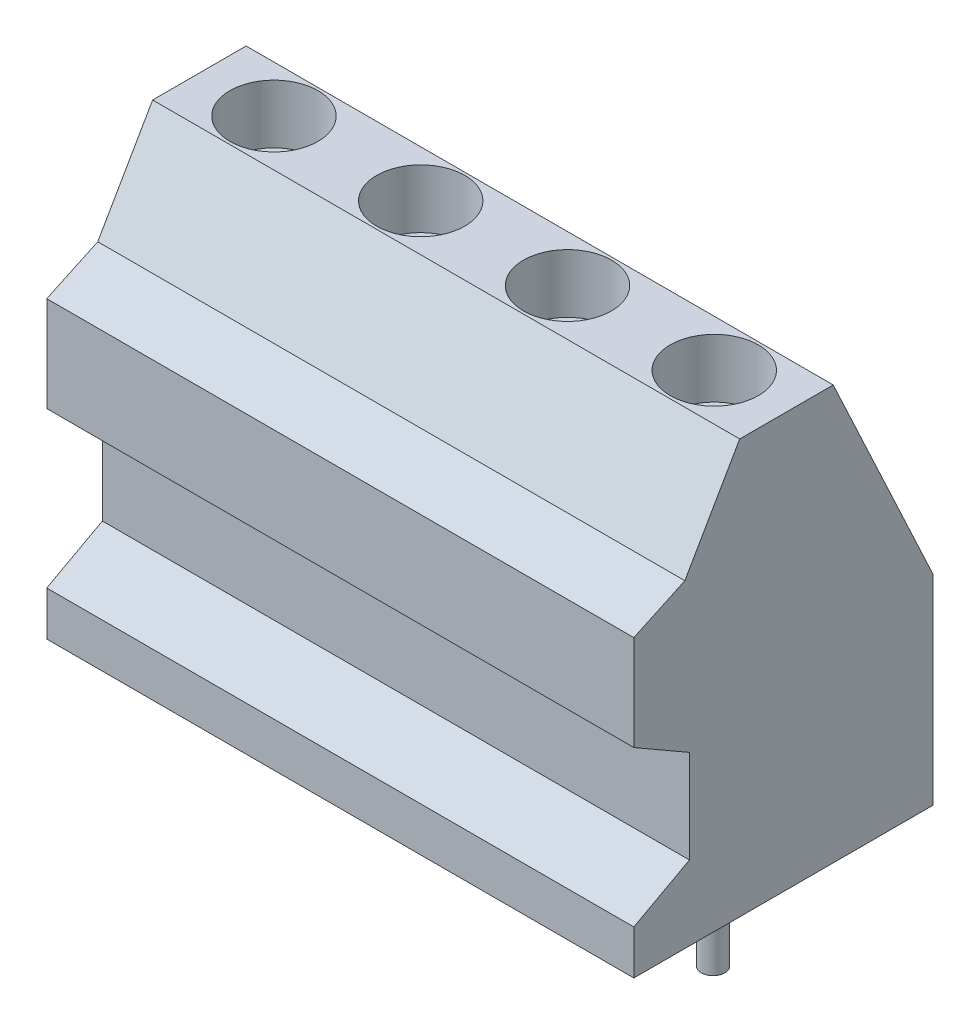
ISO-10303-21;
HEADER;
FILE_DESCRIPTION(('STEP AP214'),'2;1');
FILE_NAME('part.step','',(''),(''),'','','');
FILE_SCHEMA(('AUTOMOTIVE_DESIGN { 1 0 10303 214 1 1 1 1 }'));
ENDSEC;
DATA;
#1=APPLICATION_CONTEXT('core data for automotive mechanical design processes');
#2=APPLICATION_PROTOCOL_DEFINITION('international standard','automotive_design',2000,#1);
#3=PRODUCT_CONTEXT('',#1,'mechanical');
#4=PRODUCT('Part','Part','',(#3));
#5=PRODUCT_RELATED_PRODUCT_CATEGORY('part','',(#4));
#6=PRODUCT_DEFINITION_FORMATION('','',#4);
#7=PRODUCT_DEFINITION_CONTEXT('part definition',#1,'design');
#8=PRODUCT_DEFINITION('design','',#6,#7);
#9=PRODUCT_DEFINITION_SHAPE('','',#8);
#10=(LENGTH_UNIT() NAMED_UNIT(*) SI_UNIT(.MILLI.,.METRE.));
#11=(NAMED_UNIT(*) PLANE_ANGLE_UNIT() SI_UNIT($,.RADIAN.));
#12=(NAMED_UNIT(*) SI_UNIT($,.STERADIAN.) SOLID_ANGLE_UNIT());
#13=UNCERTAINTY_MEASURE_WITH_UNIT(LENGTH_MEASURE(1.E-05),#10,'distance_accuracy_value','');
#14=(GEOMETRIC_REPRESENTATION_CONTEXT(3) GLOBAL_UNCERTAINTY_ASSIGNED_CONTEXT((#13)) GLOBAL_UNIT_ASSIGNED_CONTEXT((#10,
#11,#12)) REPRESENTATION_CONTEXT('',''));
#15=CARTESIAN_POINT('',(0.,0.,0.));
#16=DIRECTION('',(0.,0.,1.));
#17=DIRECTION('',(1.,0.,0.));
#18=AXIS2_PLACEMENT_3D('',#15,#16,#17);
#19=CARTESIAN_POINT('',(20.,0.,0.));
#20=DIRECTION('',(0.,1.,0.));
#21=DIRECTION('',(0.,0.,1.));
#22=AXIS2_PLACEMENT_3D('',#19,#20,#21);
#23=PLANE('',#22);
#24=CARTESIAN_POINT('',(12.5,0.,0.));
#25=DIRECTION('',(0.,1.,0.));
#26=DIRECTION('',(0.,0.,1.));
#27=AXIS2_PLACEMENT_3D('',#24,#25,#26);
#28=CIRCLE('',#27,0.4);
#29=CARTESIAN_POINT('',(12.5,0.,0.4));
#30=VERTEX_POINT('',#29);
#31=EDGE_CURVE('E43',#30,#30,#28,.F.);
#32=ORIENTED_EDGE('',*,*,#31,.F.);
#33=EDGE_LOOP('',(#32));
#34=FACE_BOUND('',#33,.T.);
#35=CARTESIAN_POINT('',(2.5,0.,0.));
#36=DIRECTION('',(0.,1.,0.));
#37=DIRECTION('',(0.,0.,1.));
#38=AXIS2_PLACEMENT_3D('',#35,#36,#37);
#39=CIRCLE('',#38,0.4);
#40=CARTESIAN_POINT('',(2.5,0.,0.4));
#41=VERTEX_POINT('',#40);
#42=EDGE_CURVE('E194',#41,#41,#39,.F.);
#43=ORIENTED_EDGE('',*,*,#42,.F.);
#44=EDGE_LOOP('',(#43));
#45=FACE_BOUND('',#44,.T.);
#46=DIRECTION('',(0.,0.,-1.));
#47=VECTOR('',#46,1.);
#48=CARTESIAN_POINT('',(0.,0.,0.));
#49=LINE('',#48,#47);
#50=CARTESIAN_POINT('',(0.,0.,5.2));
#51=VERTEX_POINT('',#50);
#52=CARTESIAN_POINT('',(0.,0.,-5.));
#53=VERTEX_POINT('',#52);
#54=EDGE_CURVE('E96',#51,#53,#49,.T.);
#55=ORIENTED_EDGE('',*,*,#54,.T.);
#56=DIRECTION('',(-1.,0.,0.));
#57=VECTOR('',#56,1.);
#58=CARTESIAN_POINT('',(20.,0.,-5.));
#59=LINE('',#58,#57);
#60=CARTESIAN_POINT('',(20.,0.,-5.));
#61=VERTEX_POINT('',#60);
#62=EDGE_CURVE('E191',#61,#53,#59,.T.);
#63=ORIENTED_EDGE('',*,*,#62,.F.);
#64=DIRECTION('',(0.,0.,-1.));
#65=VECTOR('',#64,1.);
#66=CARTESIAN_POINT('',(20.,0.,5.2));
#67=LINE('',#66,#65);
#68=CARTESIAN_POINT('',(20.,0.,5.2));
#69=VERTEX_POINT('',#68);
#70=EDGE_CURVE('E102',#69,#61,#67,.T.);
#71=ORIENTED_EDGE('',*,*,#70,.F.);
#72=DIRECTION('',(-1.,0.,0.));
#73=VECTOR('',#72,1.);
#74=CARTESIAN_POINT('',(20.,0.,5.2));
#75=LINE('',#74,#73);
#76=EDGE_CURVE('E145',#69,#51,#75,.T.);
#77=ORIENTED_EDGE('',*,*,#76,.T.);
#78=EDGE_LOOP('',(#55,#63,#71,#77));
#79=FACE_BOUND('',#78,.T.);
#80=CARTESIAN_POINT('',(7.5,0.,0.));
#81=DIRECTION('',(0.,1.,0.));
#82=DIRECTION('',(0.,0.,1.));
#83=AXIS2_PLACEMENT_3D('',#80,#81,#82);
#84=CIRCLE('',#83,0.400000000000001);
#85=CARTESIAN_POINT('',(7.5,0.,0.400000000000001));
#86=VERTEX_POINT('',#85);
#87=EDGE_CURVE('E197',#86,#86,#84,.F.);
#88=ORIENTED_EDGE('',*,*,#87,.F.);
#89=EDGE_LOOP('',(#88));
#90=FACE_BOUND('',#89,.T.);
#91=CARTESIAN_POINT('',(17.5,0.,0.));
#92=DIRECTION('',(0.,1.,0.));
#93=DIRECTION('',(0.,0.,1.));
#94=AXIS2_PLACEMENT_3D('',#91,#92,#93);
#95=CIRCLE('',#94,0.400000000000001);
#96=CARTESIAN_POINT('',(17.5,0.,0.400000000000001));
#97=VERTEX_POINT('',#96);
#98=EDGE_CURVE('E11',#97,#97,#95,.F.);
#99=ORIENTED_EDGE('',*,*,#98,.F.);
#100=EDGE_LOOP('',(#99));
#101=FACE_BOUND('',#100,.T.);
#102=ADVANCED_FACE('F35',(#34,#45,#79,#90,#101),#23,.F.);
#103=CARTESIAN_POINT('',(20.,0.,-5.));
#104=DIRECTION('',(0.,0.,1.));
#105=DIRECTION('',(1.,0.,0.));
#106=AXIS2_PLACEMENT_3D('',#103,#104,#105);
#107=PLANE('',#106);
#108=DIRECTION('',(0.,1.,0.));
#109=VECTOR('',#108,1.);
#110=CARTESIAN_POINT('',(0.,0.,-5.));
#111=LINE('',#110,#109);
#112=CARTESIAN_POINT('',(0.,6.79894944949612,-5.));
#113=VERTEX_POINT('',#112);
#114=EDGE_CURVE('E150',#53,#113,#111,.T.);
#115=ORIENTED_EDGE('',*,*,#114,.T.);
#116=DIRECTION('',(-1.,0.,0.));
#117=VECTOR('',#116,1.);
#118=CARTESIAN_POINT('',(20.,6.79894944949612,-5.));
#119=LINE('',#118,#117);
#120=CARTESIAN_POINT('',(20.,6.79894944949612,-5.));
#121=VERTEX_POINT('',#120);
#122=EDGE_CURVE('E188',#121,#113,#119,.T.);
#123=ORIENTED_EDGE('',*,*,#122,.F.);
#124=DIRECTION('',(0.,1.,0.));
#125=VECTOR('',#124,1.);
#126=CARTESIAN_POINT('',(20.,0.,-5.));
#127=LINE('',#126,#125);
#128=EDGE_CURVE('E350',#61,#121,#127,.T.);
#129=ORIENTED_EDGE('',*,*,#128,.F.);
#130=ORIENTED_EDGE('',*,*,#62,.T.);
#131=EDGE_LOOP('',(#115,#123,#129,#130));
#132=FACE_BOUND('',#131,.T.);
#133=ADVANCED_FACE('F206',(#132),#107,.F.);
#134=CARTESIAN_POINT('',(20.,6.79894944949612,-5.));
#135=DIRECTION('',(0.,-0.422883614580425,0.906184003676624));
#136=DIRECTION('',(0.,-0.906184003676624,-0.422883614580425));
#137=AXIS2_PLACEMENT_3D('',#134,#135,#136);
#138=PLANE('',#137);
#139=DIRECTION('',(0.,0.906184003676624,0.422883614580425));
#140=VECTOR('',#139,1.);
#141=CARTESIAN_POINT('',(0.,6.79894944949612,-5.));
#142=LINE('',#141,#140);
#143=CARTESIAN_POINT('',(0.,14.1,-1.59286123513027));
#144=VERTEX_POINT('',#143);
#145=EDGE_CURVE('E153',#113,#144,#142,.T.);
#146=ORIENTED_EDGE('',*,*,#145,.T.);
#147=DIRECTION('',(-1.,0.,0.));
#148=VECTOR('',#147,1.);
#149=CARTESIAN_POINT('',(20.,14.1,-1.59286123513027));
#150=LINE('',#149,#148);
#151=CARTESIAN_POINT('',(20.,14.1,-1.59286123513027));
#152=VERTEX_POINT('',#151);
#153=EDGE_CURVE('E185',#152,#144,#150,.T.);
#154=ORIENTED_EDGE('',*,*,#153,.F.);
#155=DIRECTION('',(0.,0.906184003676624,0.422883614580425));
#156=VECTOR('',#155,1.);
#157=CARTESIAN_POINT('',(20.,6.79894944949612,-5.));
#158=LINE('',#157,#156);
#159=EDGE_CURVE('E326',#121,#152,#158,.T.);
#160=ORIENTED_EDGE('',*,*,#159,.F.);
#161=ORIENTED_EDGE('',*,*,#122,.T.);
#162=EDGE_LOOP('',(#146,#154,#160,#161));
#163=FACE_BOUND('',#162,.T.);
#164=ADVANCED_FACE('F313',(#163),#138,.F.);
#165=CARTESIAN_POINT('',(20.,14.1,-1.59286123513027));
#166=DIRECTION('',(0.,-1.,0.));
#167=DIRECTION('',(0.,0.,-1.));
#168=AXIS2_PLACEMENT_3D('',#165,#166,#167);
#169=PLANE('',#168);
#170=CARTESIAN_POINT('',(17.54,14.1,0.));
#171=DIRECTION('',(0.,1.,0.));
#172=DIRECTION('',(0.,0.,1.));
#173=AXIS2_PLACEMENT_3D('',#170,#171,#172);
#174=CIRCLE('',#173,1.5);
#175=CARTESIAN_POINT('',(17.54,14.1,1.5));
#176=VERTEX_POINT('',#175);
#177=EDGE_CURVE('E372',#176,#176,#174,.T.);
#178=ORIENTED_EDGE('',*,*,#177,.F.);
#179=EDGE_LOOP('',(#178));
#180=FACE_BOUND('',#179,.T.);
#181=CARTESIAN_POINT('',(12.54,14.1,0.));
#182=DIRECTION('',(0.,1.,0.));
#183=DIRECTION('',(0.,0.,1.));
#184=AXIS2_PLACEMENT_3D('',#181,#182,#183);
#185=CIRCLE('',#184,1.5);
#186=CARTESIAN_POINT('',(12.54,14.1,1.5));
#187=VERTEX_POINT('',#186);
#188=EDGE_CURVE('E366',#187,#187,#185,.T.);
#189=ORIENTED_EDGE('',*,*,#188,.F.);
#190=EDGE_LOOP('',(#189));
#191=FACE_BOUND('',#190,.T.);
#192=CARTESIAN_POINT('',(7.54,14.1,0.));
#193=DIRECTION('',(0.,1.,0.));
#194=DIRECTION('',(0.,0.,1.));
#195=AXIS2_PLACEMENT_3D('',#192,#193,#194);
#196=CIRCLE('',#195,1.5);
#197=CARTESIAN_POINT('',(7.54,14.1,1.5));
#198=VERTEX_POINT('',#197);
#199=EDGE_CURVE('E360',#198,#198,#196,.T.);
#200=ORIENTED_EDGE('',*,*,#199,.F.);
#201=EDGE_LOOP('',(#200));
#202=FACE_BOUND('',#201,.T.);
#203=CARTESIAN_POINT('',(2.54,14.1,0.));
#204=DIRECTION('',(0.,1.,0.));
#205=DIRECTION('',(0.,0.,1.));
#206=AXIS2_PLACEMENT_3D('',#203,#204,#205);
#207=CIRCLE('',#206,1.5);
#208=CARTESIAN_POINT('',(2.54,14.1,1.5));
#209=VERTEX_POINT('',#208);
#210=EDGE_CURVE('E354',#209,#209,#207,.T.);
#211=ORIENTED_EDGE('',*,*,#210,.F.);
#212=EDGE_LOOP('',(#211));
#213=FACE_BOUND('',#212,.T.);
#214=DIRECTION('',(0.,0.,1.));
#215=VECTOR('',#214,1.);
#216=CARTESIAN_POINT('',(0.,14.1,-1.59286123513027));
#217=LINE('',#216,#215);
#218=CARTESIAN_POINT('',(0.,14.1,1.59286123513027));
#219=VERTEX_POINT('',#218);
#220=EDGE_CURVE('E155',#144,#219,#217,.T.);
#221=ORIENTED_EDGE('',*,*,#220,.T.);
#222=DIRECTION('',(-1.,0.,0.));
#223=VECTOR('',#222,1.);
#224=CARTESIAN_POINT('',(20.,14.1,1.59286123513027));
#225=LINE('',#224,#223);
#226=CARTESIAN_POINT('',(20.,14.1,1.59286123513027));
#227=VERTEX_POINT('',#226);
#228=EDGE_CURVE('E182',#227,#219,#225,.T.);
#229=ORIENTED_EDGE('',*,*,#228,.F.);
#230=DIRECTION('',(0.,0.,1.));
#231=VECTOR('',#230,1.);
#232=CARTESIAN_POINT('',(20.,14.1,-1.59286123513027));
#233=LINE('',#232,#231);
#234=EDGE_CURVE('E338',#152,#227,#233,.T.);
#235=ORIENTED_EDGE('',*,*,#234,.F.);
#236=ORIENTED_EDGE('',*,*,#153,.T.);
#237=EDGE_LOOP('',(#221,#229,#235,#236));
#238=FACE_BOUND('',#237,.T.);
#239=ADVANCED_FACE('F309',(#180,#191,#202,#213,#238),#169,.F.);
#240=CARTESIAN_POINT('',(20.,14.1,1.59286123513027));
#241=DIRECTION('',(0.,-0.498918007755061,-0.866649191736611));
#242=DIRECTION('',(0.,0.866649191736611,-0.498918007755061));
#243=AXIS2_PLACEMENT_3D('',#240,#241,#242);
#244=PLANE('',#243);
#245=DIRECTION('',(0.,-0.866649191736611,0.498918007755061));
#246=VECTOR('',#245,1.);
#247=CARTESIAN_POINT('',(0.,14.1,1.59286123513027));
#248=LINE('',#247,#246);
#249=CARTESIAN_POINT('',(0.,10.8527703520918,3.46224663594181));
#250=VERTEX_POINT('',#249);
#251=EDGE_CURVE('E157',#219,#250,#248,.T.);
#252=ORIENTED_EDGE('',*,*,#251,.T.);
#253=DIRECTION('',(-1.,0.,0.));
#254=VECTOR('',#253,1.);
#255=CARTESIAN_POINT('',(20.,10.8527703520918,3.46224663594181));
#256=LINE('',#255,#254);
#257=CARTESIAN_POINT('',(20.,10.8527703520918,3.46224663594181));
#258=VERTEX_POINT('',#257);
#259=EDGE_CURVE('E179',#258,#250,#256,.T.);
#260=ORIENTED_EDGE('',*,*,#259,.F.);
#261=DIRECTION('',(0.,-0.866649191736611,0.498918007755061));
#262=VECTOR('',#261,1.);
#263=CARTESIAN_POINT('',(20.,14.1,1.59286123513027));
#264=LINE('',#263,#262);
#265=EDGE_CURVE('E335',#227,#258,#264,.T.);
#266=ORIENTED_EDGE('',*,*,#265,.F.);
#267=ORIENTED_EDGE('',*,*,#228,.T.);
#268=EDGE_LOOP('',(#252,#260,#266,#267));
#269=FACE_BOUND('',#268,.T.);
#270=ADVANCED_FACE('F305',(#269),#244,.F.);
#271=CARTESIAN_POINT('',(20.,10.8527703520918,3.46224663594181));
#272=DIRECTION('',(0.,-0.906184003676623,-0.422883614580426));
#273=DIRECTION('',(0.,0.422883614580426,-0.906184003676623));
#274=AXIS2_PLACEMENT_3D('',#271,#272,#273);
#275=PLANE('',#274);
#276=DIRECTION('',(0.,-0.422883614580426,0.906184003676623));
#277=VECTOR('',#276,1.);
#278=CARTESIAN_POINT('',(0.,10.8527703520918,3.46224663594181));
#279=LINE('',#278,#277);
#280=CARTESIAN_POINT('',(0.,10.0418231042252,5.2));
#281=VERTEX_POINT('',#280);
#282=EDGE_CURVE('E159',#250,#281,#279,.T.);
#283=ORIENTED_EDGE('',*,*,#282,.T.);
#284=DIRECTION('',(-1.,0.,0.));
#285=VECTOR('',#284,1.);
#286=CARTESIAN_POINT('',(20.,10.0418231042252,5.2));
#287=LINE('',#286,#285);
#288=CARTESIAN_POINT('',(20.,10.0418231042252,5.2));
#289=VERTEX_POINT('',#288);
#290=EDGE_CURVE('E176',#289,#281,#287,.T.);
#291=ORIENTED_EDGE('',*,*,#290,.F.);
#292=DIRECTION('',(0.,-0.422883614580426,0.906184003676623));
#293=VECTOR('',#292,1.);
#294=CARTESIAN_POINT('',(20.,10.8527703520918,3.46224663594181));
#295=LINE('',#294,#293);
#296=EDGE_CURVE('E337',#258,#289,#295,.T.);
#297=ORIENTED_EDGE('',*,*,#296,.F.);
#298=ORIENTED_EDGE('',*,*,#259,.T.);
#299=EDGE_LOOP('',(#283,#291,#297,#298));
#300=FACE_BOUND('',#299,.T.);
#301=ADVANCED_FACE('F301',(#300),#275,.F.);
#302=CARTESIAN_POINT('',(20.,10.0418231042252,5.2));
#303=DIRECTION('',(0.,0.,-1.));
#304=DIRECTION('',(-1.,0.,0.));
#305=AXIS2_PLACEMENT_3D('',#302,#303,#304);
#306=PLANE('',#305);
#307=DIRECTION('',(0.,-1.,0.));
#308=VECTOR('',#307,1.);
#309=CARTESIAN_POINT('',(0.,10.0418231042252,5.2));
#310=LINE('',#309,#308);
#311=CARTESIAN_POINT('',(0.,6.79894944949612,5.2));
#312=VERTEX_POINT('',#311);
#313=EDGE_CURVE('E161',#281,#312,#310,.T.);
#314=ORIENTED_EDGE('',*,*,#313,.T.);
#315=DIRECTION('',(-1.,0.,0.));
#316=VECTOR('',#315,1.);
#317=CARTESIAN_POINT('',(20.,6.79894944949612,5.2));
#318=LINE('',#317,#316);
#319=CARTESIAN_POINT('',(20.,6.79894944949612,5.2));
#320=VERTEX_POINT('',#319);
#321=EDGE_CURVE('E173',#320,#312,#318,.T.);
#322=ORIENTED_EDGE('',*,*,#321,.F.);
#323=DIRECTION('',(0.,-1.,0.));
#324=VECTOR('',#323,1.);
#325=CARTESIAN_POINT('',(20.,10.0418231042252,5.2));
#326=LINE('',#325,#324);
#327=EDGE_CURVE('E340',#289,#320,#326,.T.);
#328=ORIENTED_EDGE('',*,*,#327,.F.);
#329=ORIENTED_EDGE('',*,*,#290,.T.);
#330=EDGE_LOOP('',(#314,#322,#328,#329));
#331=FACE_BOUND('',#330,.T.);
#332=ADVANCED_FACE('F297',(#331),#306,.F.);
#333=CARTESIAN_POINT('',(20.,6.79894944949612,5.2));
#334=DIRECTION('',(0.,0.866649191736611,-0.498918007755061));
#335=DIRECTION('',(0.,0.498918007755061,0.866649191736611));
#336=AXIS2_PLACEMENT_3D('',#333,#334,#335);
#337=PLANE('',#336);
#338=DIRECTION('',(0.,-0.498918007755061,-0.866649191736611));
#339=VECTOR('',#338,1.);
#340=CARTESIAN_POINT('',(0.,6.79894944949612,5.2));
#341=LINE('',#340,#339);
#342=CARTESIAN_POINT('',(0.,5.70850020788453,3.30582713154656));
#343=VERTEX_POINT('',#342);
#344=EDGE_CURVE('E163',#312,#343,#341,.T.);
#345=ORIENTED_EDGE('',*,*,#344,.T.);
#346=DIRECTION('',(-1.,0.,0.));
#347=VECTOR('',#346,1.);
#348=CARTESIAN_POINT('',(20.,5.70850020788453,3.30582713154656));
#349=LINE('',#348,#347);
#350=CARTESIAN_POINT('',(20.,5.70850020788453,3.30582713154656));
#351=VERTEX_POINT('',#350);
#352=EDGE_CURVE('E140',#351,#343,#349,.T.);
#353=ORIENTED_EDGE('',*,*,#352,.F.);
#354=DIRECTION('',(0.,-0.498918007755061,-0.866649191736611));
#355=VECTOR('',#354,1.);
#356=CARTESIAN_POINT('',(20.,6.79894944949612,5.2));
#357=LINE('',#356,#355);
#358=EDGE_CURVE('E131',#320,#351,#357,.T.);
#359=ORIENTED_EDGE('',*,*,#358,.F.);
#360=ORIENTED_EDGE('',*,*,#321,.T.);
#361=EDGE_LOOP('',(#345,#353,#359,#360));
#362=FACE_BOUND('',#361,.T.);
#363=ADVANCED_FACE('F294',(#362),#337,.F.);
#364=CARTESIAN_POINT('',(20.,5.70850020788453,3.30582713154656));
#365=DIRECTION('',(0.,0.,-1.));
#366=DIRECTION('',(-1.,0.,0.));
#367=AXIS2_PLACEMENT_3D('',#364,#365,#366);
#368=PLANE('',#367);
#369=DIRECTION('',(0.,-1.,0.));
#370=VECTOR('',#369,1.);
#371=CARTESIAN_POINT('',(0.,5.70850020788453,3.30582713154656));
#372=LINE('',#371,#370);
#373=CARTESIAN_POINT('',(0.,2.53459412510442,3.30582713154656));
#374=VERTEX_POINT('',#373);
#375=EDGE_CURVE('E139',#343,#374,#372,.T.);
#376=ORIENTED_EDGE('',*,*,#375,.T.);
#377=DIRECTION('',(-1.,0.,0.));
#378=VECTOR('',#377,1.);
#379=CARTESIAN_POINT('',(20.,2.53459412510442,3.30582713154656));
#380=LINE('',#379,#378);
#381=CARTESIAN_POINT('',(20.,2.53459412510442,3.30582713154656));
#382=VERTEX_POINT('',#381);
#383=EDGE_CURVE('E136',#382,#374,#380,.T.);
#384=ORIENTED_EDGE('',*,*,#383,.F.);
#385=DIRECTION('',(0.,-1.,0.));
#386=VECTOR('',#385,1.);
#387=CARTESIAN_POINT('',(20.,5.70850020788453,3.30582713154656));
#388=LINE('',#387,#386);
#389=EDGE_CURVE('E125',#351,#382,#388,.T.);
#390=ORIENTED_EDGE('',*,*,#389,.F.);
#391=ORIENTED_EDGE('',*,*,#352,.T.);
#392=EDGE_LOOP('',(#376,#384,#390,#391));
#393=FACE_BOUND('',#392,.T.);
#394=ADVANCED_FACE('F137',(#393),#368,.F.);
#395=CARTESIAN_POINT('',(20.,2.53459412510442,3.30582713154656));
#396=DIRECTION('',(0.,-0.878817245668949,-0.477158515291137));
#397=DIRECTION('',(0.,0.477158515291137,-0.878817245668949));
#398=AXIS2_PLACEMENT_3D('',#395,#396,#397);
#399=PLANE('',#398);
#400=DIRECTION('',(0.,-0.477158515291137,0.878817245668949));
#401=VECTOR('',#400,1.);
#402=CARTESIAN_POINT('',(0.,2.53459412510442,3.30582713154656));
#403=LINE('',#402,#401);
#404=CARTESIAN_POINT('',(0.,1.50614285372773,5.2));
#405=VERTEX_POINT('',#404);
#406=EDGE_CURVE('E89',#374,#405,#403,.T.);
#407=ORIENTED_EDGE('',*,*,#406,.T.);
#408=DIRECTION('',(-1.,0.,0.));
#409=VECTOR('',#408,1.);
#410=CARTESIAN_POINT('',(20.,1.50614285372773,5.2));
#411=LINE('',#410,#409);
#412=CARTESIAN_POINT('',(20.,1.50614285372773,5.2));
#413=VERTEX_POINT('',#412);
#414=EDGE_CURVE('E141',#413,#405,#411,.T.);
#415=ORIENTED_EDGE('',*,*,#414,.F.);
#416=DIRECTION('',(0.,-0.477158515291137,0.878817245668949));
#417=VECTOR('',#416,1.);
#418=CARTESIAN_POINT('',(20.,2.53459412510442,3.30582713154656));
#419=LINE('',#418,#417);
#420=EDGE_CURVE('E129',#382,#413,#419,.T.);
#421=ORIENTED_EDGE('',*,*,#420,.F.);
#422=ORIENTED_EDGE('',*,*,#383,.T.);
#423=EDGE_LOOP('',(#407,#415,#421,#422));
#424=FACE_BOUND('',#423,.T.);
#425=ADVANCED_FACE('F143',(#424),#399,.F.);
#426=CARTESIAN_POINT('',(20.,1.50614285372773,5.2));
#427=DIRECTION('',(0.,0.,-1.));
#428=DIRECTION('',(-1.,0.,0.));
#429=AXIS2_PLACEMENT_3D('',#426,#427,#428);
#430=PLANE('',#429);
#431=DIRECTION('',(0.,-1.,0.));
#432=VECTOR('',#431,1.);
#433=CARTESIAN_POINT('',(0.,1.50614285372773,5.2));
#434=LINE('',#433,#432);
#435=EDGE_CURVE('E167',#405,#51,#434,.T.);
#436=ORIENTED_EDGE('',*,*,#435,.T.);
#437=ORIENTED_EDGE('',*,*,#76,.F.);
#438=DIRECTION('',(0.,-1.,0.));
#439=VECTOR('',#438,1.);
#440=CARTESIAN_POINT('',(20.,1.50614285372773,5.2));
#441=LINE('',#440,#439);
#442=EDGE_CURVE('E51',#413,#69,#441,.T.);
#443=ORIENTED_EDGE('',*,*,#442,.F.);
#444=ORIENTED_EDGE('',*,*,#414,.T.);
#445=EDGE_LOOP('',(#436,#437,#443,#444));
#446=FACE_BOUND('',#445,.T.);
#447=ADVANCED_FACE('F284',(#446),#430,.F.);
#448=CARTESIAN_POINT('',(20.,0.,0.));
#449=DIRECTION('',(1.,0.,0.));
#450=DIRECTION('',(0.,0.,-1.));
#451=AXIS2_PLACEMENT_3D('',#448,#449,#450);
#452=PLANE('',#451);
#453=ORIENTED_EDGE('',*,*,#70,.T.);
#454=ORIENTED_EDGE('',*,*,#128,.T.);
#455=ORIENTED_EDGE('',*,*,#159,.T.);
#456=ORIENTED_EDGE('',*,*,#234,.T.);
#457=ORIENTED_EDGE('',*,*,#265,.T.);
#458=ORIENTED_EDGE('',*,*,#296,.T.);
#459=ORIENTED_EDGE('',*,*,#327,.T.);
#460=ORIENTED_EDGE('',*,*,#358,.T.);
#461=ORIENTED_EDGE('',*,*,#389,.T.);
#462=ORIENTED_EDGE('',*,*,#420,.T.);
#463=ORIENTED_EDGE('',*,*,#442,.T.);
#464=EDGE_LOOP('',(#453,#454,#455,#456,#457,#458,#459,#460,#461,#462,#463));
#465=FACE_BOUND('',#464,.T.);
#466=ADVANCED_FACE('F127',(#465),#452,.T.);
#467=CARTESIAN_POINT('',(0.,0.,0.));
#468=DIRECTION('',(1.,0.,0.));
#469=DIRECTION('',(0.,0.,-1.));
#470=AXIS2_PLACEMENT_3D('',#467,#468,#469);
#471=PLANE('',#470);
#472=ORIENTED_EDGE('',*,*,#54,.F.);
#473=ORIENTED_EDGE('',*,*,#435,.F.);
#474=ORIENTED_EDGE('',*,*,#406,.F.);
#475=ORIENTED_EDGE('',*,*,#375,.F.);
#476=ORIENTED_EDGE('',*,*,#344,.F.);
#477=ORIENTED_EDGE('',*,*,#313,.F.);
#478=ORIENTED_EDGE('',*,*,#282,.F.);
#479=ORIENTED_EDGE('',*,*,#251,.F.);
#480=ORIENTED_EDGE('',*,*,#220,.F.);
#481=ORIENTED_EDGE('',*,*,#145,.F.);
#482=ORIENTED_EDGE('',*,*,#114,.F.);
#483=EDGE_LOOP('',(#472,#473,#474,#475,#476,#477,#478,#479,#480,#481,#482));
#484=FACE_BOUND('',#483,.T.);
#485=ADVANCED_FACE('F280',(#484),#471,.F.);
#486=CARTESIAN_POINT('',(2.54,12.1,0.));
#487=DIRECTION('',(0.,1.,0.));
#488=DIRECTION('',(0.,0.,1.));
#489=AXIS2_PLACEMENT_3D('',#486,#487,#488);
#490=CYLINDRICAL_SURFACE('',#489,1.5);
#491=CARTESIAN_POINT('',(2.54,12.1,0.));
#492=DIRECTION('',(0.,1.,0.));
#493=DIRECTION('',(0.,0.,1.));
#494=AXIS2_PLACEMENT_3D('',#491,#492,#493);
#495=CIRCLE('',#494,1.5);
#496=CARTESIAN_POINT('',(2.54,12.1,1.5));
#497=VERTEX_POINT('',#496);
#498=EDGE_CURVE('E151',#497,#497,#495,.T.);
#499=ORIENTED_EDGE('',*,*,#498,.F.);
#500=EDGE_LOOP('',(#499));
#501=FACE_BOUND('',#500,.T.);
#502=ORIENTED_EDGE('',*,*,#210,.T.);
#503=EDGE_LOOP('',(#502));
#504=FACE_BOUND('',#503,.T.);
#505=ADVANCED_FACE('F276',(#501,#504),#490,.F.);
#506=CARTESIAN_POINT('',(2.54,12.1,0.));
#507=DIRECTION('',(0.,1.,0.));
#508=DIRECTION('',(0.,0.,1.));
#509=AXIS2_PLACEMENT_3D('',#506,#507,#508);
#510=PLANE('',#509);
#511=ORIENTED_EDGE('',*,*,#498,.T.);
#512=EDGE_LOOP('',(#511));
#513=FACE_BOUND('',#512,.T.);
#514=ADVANCED_FACE('F272',(#513),#510,.T.);
#515=CARTESIAN_POINT('',(7.54,12.1,0.));
#516=DIRECTION('',(0.,1.,0.));
#517=DIRECTION('',(0.,0.,1.));
#518=AXIS2_PLACEMENT_3D('',#515,#516,#517);
#519=CYLINDRICAL_SURFACE('',#518,1.5);
#520=CARTESIAN_POINT('',(7.54,12.1,0.));
#521=DIRECTION('',(0.,1.,0.));
#522=DIRECTION('',(0.,0.,1.));
#523=AXIS2_PLACEMENT_3D('',#520,#521,#522);
#524=CIRCLE('',#523,1.5);
#525=CARTESIAN_POINT('',(7.54,12.1,1.5));
#526=VERTEX_POINT('',#525);
#527=EDGE_CURVE('E357',#526,#526,#524,.T.);
#528=ORIENTED_EDGE('',*,*,#527,.F.);
#529=EDGE_LOOP('',(#528));
#530=FACE_BOUND('',#529,.T.);
#531=ORIENTED_EDGE('',*,*,#199,.T.);
#532=EDGE_LOOP('',(#531));
#533=FACE_BOUND('',#532,.T.);
#534=ADVANCED_FACE('F268',(#530,#533),#519,.F.);
#535=CARTESIAN_POINT('',(7.54,12.1,0.));
#536=DIRECTION('',(0.,1.,0.));
#537=DIRECTION('',(0.,0.,1.));
#538=AXIS2_PLACEMENT_3D('',#535,#536,#537);
#539=PLANE('',#538);
#540=ORIENTED_EDGE('',*,*,#527,.T.);
#541=EDGE_LOOP('',(#540));
#542=FACE_BOUND('',#541,.T.);
#543=ADVANCED_FACE('F264',(#542),#539,.T.);
#544=CARTESIAN_POINT('',(12.54,12.1,0.));
#545=DIRECTION('',(0.,1.,0.));
#546=DIRECTION('',(0.,0.,1.));
#547=AXIS2_PLACEMENT_3D('',#544,#545,#546);
#548=CYLINDRICAL_SURFACE('',#547,1.5);
#549=CARTESIAN_POINT('',(12.54,12.1,0.));
#550=DIRECTION('',(0.,1.,0.));
#551=DIRECTION('',(0.,0.,1.));
#552=AXIS2_PLACEMENT_3D('',#549,#550,#551);
#553=CIRCLE('',#552,1.5);
#554=CARTESIAN_POINT('',(12.54,12.1,1.5));
#555=VERTEX_POINT('',#554);
#556=EDGE_CURVE('E363',#555,#555,#553,.T.);
#557=ORIENTED_EDGE('',*,*,#556,.F.);
#558=EDGE_LOOP('',(#557));
#559=FACE_BOUND('',#558,.T.);
#560=ORIENTED_EDGE('',*,*,#188,.T.);
#561=EDGE_LOOP('',(#560));
#562=FACE_BOUND('',#561,.T.);
#563=ADVANCED_FACE('F260',(#559,#562),#548,.F.);
#564=CARTESIAN_POINT('',(12.54,12.1,0.));
#565=DIRECTION('',(0.,1.,0.));
#566=DIRECTION('',(0.,0.,1.));
#567=AXIS2_PLACEMENT_3D('',#564,#565,#566);
#568=PLANE('',#567);
#569=ORIENTED_EDGE('',*,*,#556,.T.);
#570=EDGE_LOOP('',(#569));
#571=FACE_BOUND('',#570,.T.);
#572=ADVANCED_FACE('F256',(#571),#568,.T.);
#573=CARTESIAN_POINT('',(17.54,12.1,0.));
#574=DIRECTION('',(0.,1.,0.));
#575=DIRECTION('',(0.,0.,1.));
#576=AXIS2_PLACEMENT_3D('',#573,#574,#575);
#577=CYLINDRICAL_SURFACE('',#576,1.5);
#578=CARTESIAN_POINT('',(17.54,12.1,0.));
#579=DIRECTION('',(0.,1.,0.));
#580=DIRECTION('',(0.,0.,1.));
#581=AXIS2_PLACEMENT_3D('',#578,#579,#580);
#582=CIRCLE('',#581,1.5);
#583=CARTESIAN_POINT('',(17.54,12.1,1.5));
#584=VERTEX_POINT('',#583);
#585=EDGE_CURVE('E369',#584,#584,#582,.T.);
#586=ORIENTED_EDGE('',*,*,#585,.F.);
#587=EDGE_LOOP('',(#586));
#588=FACE_BOUND('',#587,.T.);
#589=ORIENTED_EDGE('',*,*,#177,.T.);
#590=EDGE_LOOP('',(#589));
#591=FACE_BOUND('',#590,.T.);
#592=ADVANCED_FACE('F252',(#588,#591),#577,.F.);
#593=CARTESIAN_POINT('',(17.54,12.1,0.));
#594=DIRECTION('',(0.,1.,0.));
#595=DIRECTION('',(0.,0.,1.));
#596=AXIS2_PLACEMENT_3D('',#593,#594,#595);
#597=PLANE('',#596);
#598=ORIENTED_EDGE('',*,*,#585,.T.);
#599=EDGE_LOOP('',(#598));
#600=FACE_BOUND('',#599,.T.);
#601=ADVANCED_FACE('F248',(#600),#597,.T.);
#602=CARTESIAN_POINT('',(2.5,-3.5,0.));
#603=DIRECTION('',(0.,1.,0.));
#604=DIRECTION('',(0.,0.,1.));
#605=AXIS2_PLACEMENT_3D('',#602,#603,#604);
#606=CYLINDRICAL_SURFACE('',#605,0.4);
#607=CARTESIAN_POINT('',(2.5,-3.5,0.));
#608=DIRECTION('',(0.,-1.,0.));
#609=DIRECTION('',(0.,0.,-1.));
#610=AXIS2_PLACEMENT_3D('',#607,#608,#609);
#611=CIRCLE('',#610,0.4);
#612=CARTESIAN_POINT('',(2.5,-3.5,-0.4));
#613=VERTEX_POINT('',#612);
#614=EDGE_CURVE('E375',#613,#613,#611,.T.);
#615=ORIENTED_EDGE('',*,*,#614,.F.);
#616=EDGE_LOOP('',(#615));
#617=FACE_BOUND('',#616,.T.);
#618=ORIENTED_EDGE('',*,*,#42,.T.);
#619=EDGE_LOOP('',(#618));
#620=FACE_BOUND('',#619,.T.);
#621=ADVANCED_FACE('F244',(#617,#620),#606,.T.);
#622=CARTESIAN_POINT('',(2.5,-3.5,0.));
#623=DIRECTION('',(0.,-1.,0.));
#624=DIRECTION('',(0.,0.,-1.));
#625=AXIS2_PLACEMENT_3D('',#622,#623,#624);
#626=PLANE('',#625);
#627=ORIENTED_EDGE('',*,*,#614,.T.);
#628=EDGE_LOOP('',(#627));
#629=FACE_BOUND('',#628,.T.);
#630=ADVANCED_FACE('F240',(#629),#626,.T.);
#631=CARTESIAN_POINT('',(7.5,-3.5,0.));
#632=DIRECTION('',(0.,1.,0.));
#633=DIRECTION('',(0.,0.,1.));
#634=AXIS2_PLACEMENT_3D('',#631,#632,#633);
#635=CYLINDRICAL_SURFACE('',#634,0.400000000000001);
#636=CARTESIAN_POINT('',(7.5,-3.5,0.));
#637=DIRECTION('',(0.,-1.,0.));
#638=DIRECTION('',(0.,0.,-1.));
#639=AXIS2_PLACEMENT_3D('',#636,#637,#638);
#640=CIRCLE('',#639,0.400000000000001);
#641=CARTESIAN_POINT('',(7.5,-3.5,-0.400000000000001));
#642=VERTEX_POINT('',#641);
#643=EDGE_CURVE('E380',#642,#642,#640,.T.);
#644=ORIENTED_EDGE('',*,*,#643,.F.);
#645=EDGE_LOOP('',(#644));
#646=FACE_BOUND('',#645,.T.);
#647=ORIENTED_EDGE('',*,*,#87,.T.);
#648=EDGE_LOOP('',(#647));
#649=FACE_BOUND('',#648,.T.);
#650=ADVANCED_FACE('F236',(#646,#649),#635,.T.);
#651=CARTESIAN_POINT('',(7.5,-3.5,0.));
#652=DIRECTION('',(0.,-1.,0.));
#653=DIRECTION('',(0.,0.,-1.));
#654=AXIS2_PLACEMENT_3D('',#651,#652,#653);
#655=PLANE('',#654);
#656=ORIENTED_EDGE('',*,*,#643,.T.);
#657=EDGE_LOOP('',(#656));
#658=FACE_BOUND('',#657,.T.);
#659=ADVANCED_FACE('F232',(#658),#655,.T.);
#660=CARTESIAN_POINT('',(12.5,-3.5,0.));
#661=DIRECTION('',(0.,1.,0.));
#662=DIRECTION('',(0.,0.,1.));
#663=AXIS2_PLACEMENT_3D('',#660,#661,#662);
#664=CYLINDRICAL_SURFACE('',#663,0.4);
#665=CARTESIAN_POINT('',(12.5,-3.5,0.));
#666=DIRECTION('',(0.,-1.,0.));
#667=DIRECTION('',(0.,0.,-1.));
#668=AXIS2_PLACEMENT_3D('',#665,#666,#667);
#669=CIRCLE('',#668,0.4);
#670=CARTESIAN_POINT('',(12.5,-3.5,-0.4));
#671=VERTEX_POINT('',#670);
#672=EDGE_CURVE('E383',#671,#671,#669,.T.);
#673=ORIENTED_EDGE('',*,*,#672,.F.);
#674=EDGE_LOOP('',(#673));
#675=FACE_BOUND('',#674,.T.);
#676=ORIENTED_EDGE('',*,*,#31,.T.);
#677=EDGE_LOOP('',(#676));
#678=FACE_BOUND('',#677,.T.);
#679=ADVANCED_FACE('F202',(#675,#678),#664,.T.);
#680=CARTESIAN_POINT('',(12.5,-3.5,0.));
#681=DIRECTION('',(0.,-1.,0.));
#682=DIRECTION('',(0.,0.,-1.));
#683=AXIS2_PLACEMENT_3D('',#680,#681,#682);
#684=PLANE('',#683);
#685=ORIENTED_EDGE('',*,*,#672,.T.);
#686=EDGE_LOOP('',(#685));
#687=FACE_BOUND('',#686,.T.);
#688=ADVANCED_FACE('F217',(#687),#684,.T.);
#689=CARTESIAN_POINT('',(17.5,-3.5,0.));
#690=DIRECTION('',(0.,1.,0.));
#691=DIRECTION('',(0.,0.,1.));
#692=AXIS2_PLACEMENT_3D('',#689,#690,#691);
#693=CYLINDRICAL_SURFACE('',#692,0.400000000000001);
#694=CARTESIAN_POINT('',(17.5,-3.5,0.));
#695=DIRECTION('',(0.,-1.,0.));
#696=DIRECTION('',(0.,0.,-1.));
#697=AXIS2_PLACEMENT_3D('',#694,#695,#696);
#698=CIRCLE('',#697,0.400000000000001);
#699=CARTESIAN_POINT('',(17.5,-3.5,-0.400000000000001));
#700=VERTEX_POINT('',#699);
#701=EDGE_CURVE('E386',#700,#700,#698,.T.);
#702=ORIENTED_EDGE('',*,*,#701,.F.);
#703=EDGE_LOOP('',(#702));
#704=FACE_BOUND('',#703,.T.);
#705=ORIENTED_EDGE('',*,*,#98,.T.);
#706=EDGE_LOOP('',(#705));
#707=FACE_BOUND('',#706,.T.);
#708=ADVANCED_FACE('F214',(#704,#707),#693,.T.);
#709=CARTESIAN_POINT('',(17.5,-3.5,0.));
#710=DIRECTION('',(0.,-1.,0.));
#711=DIRECTION('',(0.,0.,-1.));
#712=AXIS2_PLACEMENT_3D('',#709,#710,#711);
#713=PLANE('',#712);
#714=ORIENTED_EDGE('',*,*,#701,.T.);
#715=EDGE_LOOP('',(#714));
#716=FACE_BOUND('',#715,.T.);
#717=ADVANCED_FACE('F216',(#716),#713,.T.);
#718=CLOSED_SHELL('',(#102,#133,#164,#239,#270,#301,#332,#363,#394,#425,#447,#466,#485,#505,
#514,#534,#543,#563,#572,#592,#601,#621,#630,#650,#659,#679,#688,#708,#717));
#719=MANIFOLD_SOLID_BREP('B2',#718);
#720=ADVANCED_BREP_SHAPE_REPRESENTATION('',(#18,#719),#14);
#721=SHAPE_DEFINITION_REPRESENTATION(#9,#720);
ENDSEC;
END-ISO-10303-21;
